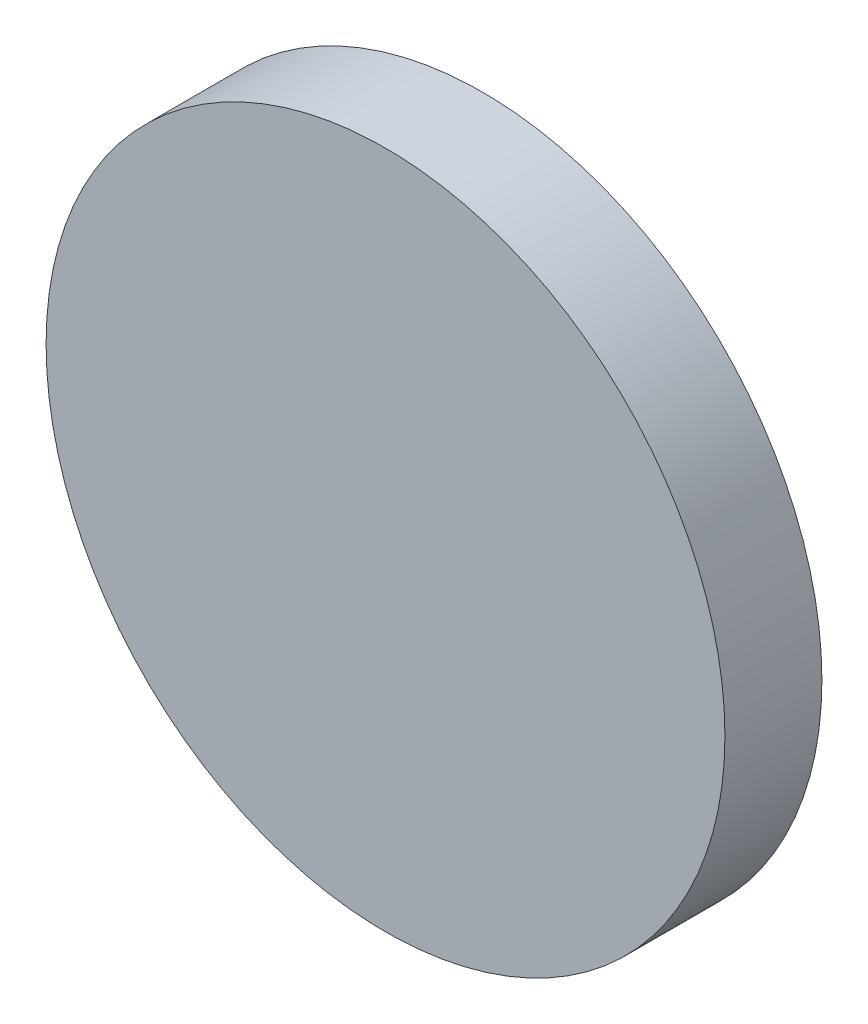
ISO-10303-21;
HEADER;
FILE_DESCRIPTION(('STEP AP214'),'2;1');
FILE_NAME('part.step','',(''),(''),'','','');
FILE_SCHEMA(('AUTOMOTIVE_DESIGN { 1 0 10303 214 1 1 1 1 }'));
ENDSEC;
DATA;
#1=APPLICATION_CONTEXT('core data for automotive mechanical design processes');
#2=APPLICATION_PROTOCOL_DEFINITION('international standard','automotive_design',2000,#1);
#3=PRODUCT_CONTEXT('',#1,'mechanical');
#4=PRODUCT('Part','Part','',(#3));
#5=PRODUCT_RELATED_PRODUCT_CATEGORY('part','',(#4));
#6=PRODUCT_DEFINITION_FORMATION('','',#4);
#7=PRODUCT_DEFINITION_CONTEXT('part definition',#1,'design');
#8=PRODUCT_DEFINITION('design','',#6,#7);
#9=PRODUCT_DEFINITION_SHAPE('','',#8);
#10=(LENGTH_UNIT() NAMED_UNIT(*) SI_UNIT(.MILLI.,.METRE.));
#11=(NAMED_UNIT(*) PLANE_ANGLE_UNIT() SI_UNIT($,.RADIAN.));
#12=(NAMED_UNIT(*) SI_UNIT($,.STERADIAN.) SOLID_ANGLE_UNIT());
#13=UNCERTAINTY_MEASURE_WITH_UNIT(LENGTH_MEASURE(1.E-05),#10,'distance_accuracy_value','');
#14=(GEOMETRIC_REPRESENTATION_CONTEXT(3) GLOBAL_UNCERTAINTY_ASSIGNED_CONTEXT((#13)) GLOBAL_UNIT_ASSIGNED_CONTEXT((#10,
#11,#12)) REPRESENTATION_CONTEXT('',''));
#15=CARTESIAN_POINT('',(0.,0.,0.));
#16=DIRECTION('',(0.,0.,1.));
#17=DIRECTION('',(1.,0.,0.));
#18=AXIS2_PLACEMENT_3D('',#15,#16,#17);
#19=CARTESIAN_POINT('',(0.,0.,1.));
#20=DIRECTION('',(0.,0.,-1.));
#21=DIRECTION('',(-1.,0.,0.));
#22=AXIS2_PLACEMENT_3D('',#19,#20,#21);
#23=CYLINDRICAL_SURFACE('',#22,3.5);
#24=CARTESIAN_POINT('',(0.,0.,1.));
#25=DIRECTION('',(0.,0.,1.));
#26=DIRECTION('',(1.,0.,0.));
#27=AXIS2_PLACEMENT_3D('',#24,#25,#26);
#28=CIRCLE('',#27,3.5);
#29=CARTESIAN_POINT('',(3.5,0.,1.));
#30=VERTEX_POINT('',#29);
#31=EDGE_CURVE('E10',#30,#30,#28,.T.);
#32=ORIENTED_EDGE('',*,*,#31,.F.);
#33=EDGE_LOOP('',(#32));
#34=FACE_BOUND('',#33,.T.);
#35=CARTESIAN_POINT('',(0.,0.,0.));
#36=DIRECTION('',(0.,0.,1.));
#37=DIRECTION('',(1.,0.,0.));
#38=AXIS2_PLACEMENT_3D('',#35,#36,#37);
#39=CIRCLE('',#38,3.5);
#40=CARTESIAN_POINT('',(3.5,0.,0.));
#41=VERTEX_POINT('',#40);
#42=EDGE_CURVE('E34',#41,#41,#39,.T.);
#43=ORIENTED_EDGE('',*,*,#42,.T.);
#44=EDGE_LOOP('',(#43));
#45=FACE_BOUND('',#44,.T.);
#46=ADVANCED_FACE('F31',(#34,#45),#23,.T.);
#47=CARTESIAN_POINT('',(0.,0.,1.));
#48=DIRECTION('',(0.,0.,1.));
#49=DIRECTION('',(1.,0.,0.));
#50=AXIS2_PLACEMENT_3D('',#47,#48,#49);
#51=PLANE('',#50);
#52=ORIENTED_EDGE('',*,*,#31,.T.);
#53=EDGE_LOOP('',(#52));
#54=FACE_BOUND('',#53,.T.);
#55=ADVANCED_FACE('F46',(#54),#51,.T.);
#56=CARTESIAN_POINT('',(0.,0.,0.));
#57=DIRECTION('',(0.,0.,1.));
#58=DIRECTION('',(1.,0.,0.));
#59=AXIS2_PLACEMENT_3D('',#56,#57,#58);
#60=PLANE('',#59);
#61=ORIENTED_EDGE('',*,*,#42,.F.);
#62=EDGE_LOOP('',(#61));
#63=FACE_BOUND('',#62,.T.);
#64=ADVANCED_FACE('F44',(#63),#60,.F.);
#65=CLOSED_SHELL('',(#46,#55,#64));
#66=MANIFOLD_SOLID_BREP('B2',#65);
#67=ADVANCED_BREP_SHAPE_REPRESENTATION('',(#18,#66),#14);
#68=SHAPE_DEFINITION_REPRESENTATION(#9,#67);
ENDSEC;
END-ISO-10303-21;
